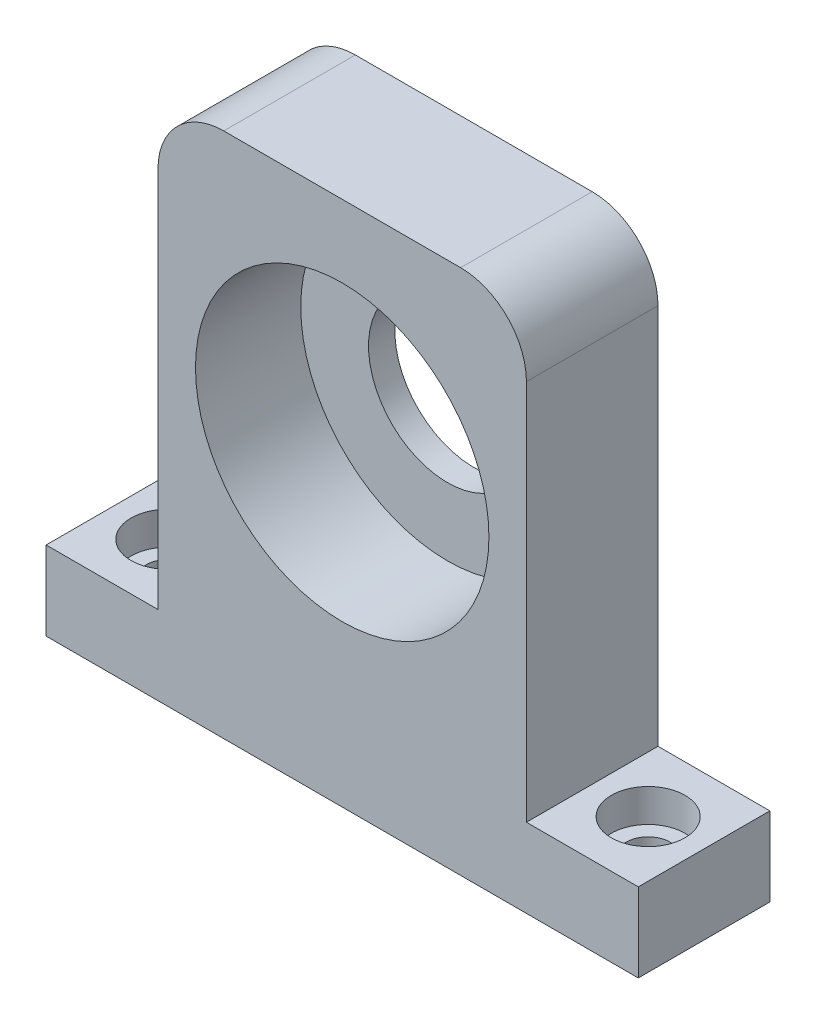
ISO-10303-21;
HEADER;
FILE_DESCRIPTION(('STEP AP214'),'2;1');
FILE_NAME('part.step','',(''),(''),'','','');
FILE_SCHEMA(('AUTOMOTIVE_DESIGN { 1 0 10303 214 1 1 1 1 }'));
ENDSEC;
DATA;
#1=APPLICATION_CONTEXT('core data for automotive mechanical design processes');
#2=APPLICATION_PROTOCOL_DEFINITION('international standard','automotive_design',2000,#1);
#3=PRODUCT_CONTEXT('',#1,'mechanical');
#4=PRODUCT('Part','Part','',(#3));
#5=PRODUCT_RELATED_PRODUCT_CATEGORY('part','',(#4));
#6=PRODUCT_DEFINITION_FORMATION('','',#4);
#7=PRODUCT_DEFINITION_CONTEXT('part definition',#1,'design');
#8=PRODUCT_DEFINITION('design','',#6,#7);
#9=PRODUCT_DEFINITION_SHAPE('','',#8);
#10=(LENGTH_UNIT() NAMED_UNIT(*) SI_UNIT(.MILLI.,.METRE.));
#11=(NAMED_UNIT(*) PLANE_ANGLE_UNIT() SI_UNIT($,.RADIAN.));
#12=(NAMED_UNIT(*) SI_UNIT($,.STERADIAN.) SOLID_ANGLE_UNIT());
#13=UNCERTAINTY_MEASURE_WITH_UNIT(LENGTH_MEASURE(1.E-05),#10,'distance_accuracy_value','');
#14=(GEOMETRIC_REPRESENTATION_CONTEXT(3) GLOBAL_UNCERTAINTY_ASSIGNED_CONTEXT((#13)) GLOBAL_UNIT_ASSIGNED_CONTEXT((#10,
#11,#12)) REPRESENTATION_CONTEXT('',''));
#15=CARTESIAN_POINT('',(0.,0.,0.));
#16=DIRECTION('',(0.,0.,1.));
#17=DIRECTION('',(1.,0.,0.));
#18=AXIS2_PLACEMENT_3D('',#15,#16,#17);
#19=CARTESIAN_POINT('',(0.,17.,10.));
#20=DIRECTION('',(0.,1.,0.));
#21=DIRECTION('',(0.,0.,1.));
#22=AXIS2_PLACEMENT_3D('',#19,#20,#21);
#23=PLANE('',#22);
#24=DIRECTION('',(1.,0.,0.));
#25=VECTOR('',#24,1.);
#26=CARTESIAN_POINT('',(0.,17.,0.));
#27=LINE('',#26,#25);
#28=CARTESIAN_POINT('',(-9.,17.,0.));
#29=VERTEX_POINT('',#28);
#30=CARTESIAN_POINT('',(9.,17.,0.));
#31=VERTEX_POINT('',#30);
#32=EDGE_CURVE('E183',#29,#31,#27,.T.);
#33=ORIENTED_EDGE('',*,*,#32,.F.);
#34=DIRECTION('',(0.,0.,-1.));
#35=VECTOR('',#34,1.);
#36=CARTESIAN_POINT('',(-9.,17.,10.));
#37=LINE('',#36,#35);
#38=CARTESIAN_POINT('',(-9.,17.,10.));
#39=VERTEX_POINT('',#38);
#40=EDGE_CURVE('E230',#29,#39,#37,.F.);
#41=ORIENTED_EDGE('',*,*,#40,.T.);
#42=DIRECTION('',(1.,0.,0.));
#43=VECTOR('',#42,1.);
#44=CARTESIAN_POINT('',(0.,17.,10.));
#45=LINE('',#44,#43);
#46=CARTESIAN_POINT('',(9.,17.,10.));
#47=VERTEX_POINT('',#46);
#48=EDGE_CURVE('E129',#39,#47,#45,.T.);
#49=ORIENTED_EDGE('',*,*,#48,.T.);
#50=DIRECTION('',(0.,0.,-1.));
#51=VECTOR('',#50,1.);
#52=CARTESIAN_POINT('',(9.,17.,10.));
#53=LINE('',#52,#51);
#54=EDGE_CURVE('E226',#47,#31,#53,.T.);
#55=ORIENTED_EDGE('',*,*,#54,.T.);
#56=EDGE_LOOP('',(#33,#41,#49,#55));
#57=FACE_BOUND('',#56,.T.);
#58=ADVANCED_FACE('F16',(#57),#23,.T.);
#59=CARTESIAN_POINT('',(-14.,9.43283759813625,10.));
#60=DIRECTION('',(1.,0.,0.));
#61=DIRECTION('',(0.,1.,0.));
#62=AXIS2_PLACEMENT_3D('',#59,#60,#61);
#63=PLANE('',#62);
#64=DIRECTION('',(0.,-1.,0.));
#65=VECTOR('',#64,1.);
#66=CARTESIAN_POINT('',(-14.,9.43283759813625,10.));
#67=LINE('',#66,#65);
#68=CARTESIAN_POINT('',(-14.,12.,10.));
#69=VERTEX_POINT('',#68);
#70=CARTESIAN_POINT('',(-14.,-17.,10.));
#71=VERTEX_POINT('',#70);
#72=EDGE_CURVE('E117',#69,#71,#67,.T.);
#73=ORIENTED_EDGE('',*,*,#72,.F.);
#74=DIRECTION('',(0.,0.,-1.));
#75=VECTOR('',#74,1.);
#76=CARTESIAN_POINT('',(-14.,12.,0.));
#77=LINE('',#76,#75);
#78=CARTESIAN_POINT('',(-14.,12.,0.));
#79=VERTEX_POINT('',#78);
#80=EDGE_CURVE('E217',#69,#79,#77,.T.);
#81=ORIENTED_EDGE('',*,*,#80,.T.);
#82=DIRECTION('',(0.,-1.,0.));
#83=VECTOR('',#82,1.);
#84=CARTESIAN_POINT('',(-14.,9.43283759813625,0.));
#85=LINE('',#84,#83);
#86=CARTESIAN_POINT('',(-14.,-17.,0.));
#87=VERTEX_POINT('',#86);
#88=EDGE_CURVE('E135',#79,#87,#85,.T.);
#89=ORIENTED_EDGE('',*,*,#88,.T.);
#90=DIRECTION('',(0.,0.,-1.));
#91=VECTOR('',#90,1.);
#92=CARTESIAN_POINT('',(-14.,-17.,10.));
#93=LINE('',#92,#91);
#94=EDGE_CURVE('E132',#71,#87,#93,.T.);
#95=ORIENTED_EDGE('',*,*,#94,.F.);
#96=EDGE_LOOP('',(#73,#81,#89,#95));
#97=FACE_BOUND('',#96,.T.);
#98=ADVANCED_FACE('F133',(#97),#63,.F.);
#99=CARTESIAN_POINT('',(2.3660259321332,-17.,10.));
#100=DIRECTION('',(0.,1.,0.));
#101=DIRECTION('',(-1.,0.,0.));
#102=AXIS2_PLACEMENT_3D('',#99,#100,#101);
#103=PLANE('',#102);
#104=CARTESIAN_POINT('',(-18.25,-17.,5.));
#105=DIRECTION('',(0.,1.,0.));
#106=DIRECTION('',(-1.,0.,0.));
#107=AXIS2_PLACEMENT_3D('',#104,#105,#106);
#108=CIRCLE('',#107,2.8);
#109=CARTESIAN_POINT('',(-21.05,-17.,5.));
#110=VERTEX_POINT('',#109);
#111=EDGE_CURVE('E381',#110,#110,#108,.T.);
#112=ORIENTED_EDGE('',*,*,#111,.F.);
#113=EDGE_LOOP('',(#112));
#114=FACE_BOUND('',#113,.T.);
#115=DIRECTION('',(1.,0.,0.));
#116=VECTOR('',#115,1.);
#117=CARTESIAN_POINT('',(2.3660259321332,-17.,0.));
#118=LINE('',#117,#116);
#119=CARTESIAN_POINT('',(-22.5,-17.,0.));
#120=VERTEX_POINT('',#119);
#121=EDGE_CURVE('E195',#120,#87,#118,.T.);
#122=ORIENTED_EDGE('',*,*,#121,.F.);
#123=DIRECTION('',(0.,0.,-1.));
#124=VECTOR('',#123,1.);
#125=CARTESIAN_POINT('',(-22.5,-17.,10.));
#126=LINE('',#125,#124);
#127=CARTESIAN_POINT('',(-22.5,-17.,10.));
#128=VERTEX_POINT('',#127);
#129=EDGE_CURVE('E141',#128,#120,#126,.T.);
#130=ORIENTED_EDGE('',*,*,#129,.F.);
#131=DIRECTION('',(1.,0.,0.));
#132=VECTOR('',#131,1.);
#133=CARTESIAN_POINT('',(2.3660259321332,-17.,10.));
#134=LINE('',#133,#132);
#135=EDGE_CURVE('E122',#128,#71,#134,.T.);
#136=ORIENTED_EDGE('',*,*,#135,.T.);
#137=ORIENTED_EDGE('',*,*,#94,.T.);
#138=EDGE_LOOP('',(#122,#130,#136,#137));
#139=FACE_BOUND('',#138,.T.);
#140=ADVANCED_FACE('F143',(#114,#139),#103,.T.);
#141=CARTESIAN_POINT('',(-22.5,-23.0140389875682,10.));
#142=DIRECTION('',(1.,0.,0.));
#143=DIRECTION('',(0.,1.,0.));
#144=AXIS2_PLACEMENT_3D('',#141,#142,#143);
#145=PLANE('',#144);
#146=DIRECTION('',(0.,-1.,0.));
#147=VECTOR('',#146,1.);
#148=CARTESIAN_POINT('',(-22.5,-23.0140389875682,0.));
#149=LINE('',#148,#147);
#150=CARTESIAN_POINT('',(-22.5,-23.,0.));
#151=VERTEX_POINT('',#150);
#152=EDGE_CURVE('E198',#120,#151,#149,.T.);
#153=ORIENTED_EDGE('',*,*,#152,.T.);
#154=DIRECTION('',(0.,0.,-1.));
#155=VECTOR('',#154,1.);
#156=CARTESIAN_POINT('',(-22.5,-23.,10.));
#157=LINE('',#156,#155);
#158=CARTESIAN_POINT('',(-22.5,-23.,10.));
#159=VERTEX_POINT('',#158);
#160=EDGE_CURVE('E211',#159,#151,#157,.T.);
#161=ORIENTED_EDGE('',*,*,#160,.F.);
#162=DIRECTION('',(0.,-1.,0.));
#163=VECTOR('',#162,1.);
#164=CARTESIAN_POINT('',(-22.5,-23.0140389875682,10.));
#165=LINE('',#164,#163);
#166=EDGE_CURVE('E146',#128,#159,#165,.T.);
#167=ORIENTED_EDGE('',*,*,#166,.F.);
#168=ORIENTED_EDGE('',*,*,#129,.T.);
#169=EDGE_LOOP('',(#153,#161,#167,#168));
#170=FACE_BOUND('',#169,.T.);
#171=ADVANCED_FACE('F384',(#170),#145,.F.);
#172=CARTESIAN_POINT('',(2.3660259321332,-23.,10.));
#173=DIRECTION('',(0.,1.,0.));
#174=DIRECTION('',(-1.,0.,0.));
#175=AXIS2_PLACEMENT_3D('',#172,#173,#174);
#176=PLANE('',#175);
#177=CARTESIAN_POINT('',(18.25,-23.0000000000245,5.));
#178=DIRECTION('',(0.,-1.,0.));
#179=DIRECTION('',(1.,0.,0.));
#180=AXIS2_PLACEMENT_3D('',#177,#178,#179);
#181=CIRCLE('',#180,1.65);
#182=CARTESIAN_POINT('',(19.9,-23.0000000000245,5.));
#183=VERTEX_POINT('',#182);
#184=EDGE_CURVE('E367',#183,#183,#181,.F.);
#185=ORIENTED_EDGE('',*,*,#184,.T.);
#186=EDGE_LOOP('',(#185));
#187=FACE_BOUND('',#186,.T.);
#188=CARTESIAN_POINT('',(-18.25,-23.0000000000245,5.));
#189=DIRECTION('',(0.,1.,0.));
#190=DIRECTION('',(-1.,0.,0.));
#191=AXIS2_PLACEMENT_3D('',#188,#189,#190);
#192=CIRCLE('',#191,1.65);
#193=CARTESIAN_POINT('',(-19.9,-23.0000000000245,5.));
#194=VERTEX_POINT('',#193);
#195=EDGE_CURVE('E428',#194,#194,#192,.F.);
#196=ORIENTED_EDGE('',*,*,#195,.F.);
#197=EDGE_LOOP('',(#196));
#198=FACE_BOUND('',#197,.T.);
#199=DIRECTION('',(1.,0.,0.));
#200=VECTOR('',#199,1.);
#201=CARTESIAN_POINT('',(2.3660259321332,-23.,0.));
#202=LINE('',#201,#200);
#203=CARTESIAN_POINT('',(22.5,-23.,0.));
#204=VERTEX_POINT('',#203);
#205=EDGE_CURVE('E201',#151,#204,#202,.T.);
#206=ORIENTED_EDGE('',*,*,#205,.T.);
#207=DIRECTION('',(0.,0.,-1.));
#208=VECTOR('',#207,1.);
#209=CARTESIAN_POINT('',(22.5,-23.,10.));
#210=LINE('',#209,#208);
#211=CARTESIAN_POINT('',(22.5,-23.,10.));
#212=VERTEX_POINT('',#211);
#213=EDGE_CURVE('E208',#212,#204,#210,.T.);
#214=ORIENTED_EDGE('',*,*,#213,.F.);
#215=DIRECTION('',(1.,0.,0.));
#216=VECTOR('',#215,1.);
#217=CARTESIAN_POINT('',(2.3660259321332,-23.,10.));
#218=LINE('',#217,#216);
#219=EDGE_CURVE('E154',#159,#212,#218,.T.);
#220=ORIENTED_EDGE('',*,*,#219,.F.);
#221=ORIENTED_EDGE('',*,*,#160,.T.);
#222=EDGE_LOOP('',(#206,#214,#220,#221));
#223=FACE_BOUND('',#222,.T.);
#224=ADVANCED_FACE('F392',(#187,#198,#223),#176,.F.);
#225=CARTESIAN_POINT('',(22.5,-23.0140389875682,10.));
#226=DIRECTION('',(1.,0.,0.));
#227=DIRECTION('',(0.,1.,0.));
#228=AXIS2_PLACEMENT_3D('',#225,#226,#227);
#229=PLANE('',#228);
#230=DIRECTION('',(0.,-1.,0.));
#231=VECTOR('',#230,1.);
#232=CARTESIAN_POINT('',(22.5,-23.0140389875682,0.));
#233=LINE('',#232,#231);
#234=CARTESIAN_POINT('',(22.5,-17.,0.));
#235=VERTEX_POINT('',#234);
#236=EDGE_CURVE('E194',#235,#204,#233,.T.);
#237=ORIENTED_EDGE('',*,*,#236,.F.);
#238=DIRECTION('',(0.,0.,-1.));
#239=VECTOR('',#238,1.);
#240=CARTESIAN_POINT('',(22.5,-17.,10.));
#241=LINE('',#240,#239);
#242=CARTESIAN_POINT('',(22.5,-17.,10.));
#243=VERTEX_POINT('',#242);
#244=EDGE_CURVE('E171',#243,#235,#241,.T.);
#245=ORIENTED_EDGE('',*,*,#244,.F.);
#246=DIRECTION('',(0.,-1.,0.));
#247=VECTOR('',#246,1.);
#248=CARTESIAN_POINT('',(22.5,-23.0140389875682,10.));
#249=LINE('',#248,#247);
#250=EDGE_CURVE('E163',#243,#212,#249,.T.);
#251=ORIENTED_EDGE('',*,*,#250,.T.);
#252=ORIENTED_EDGE('',*,*,#213,.T.);
#253=EDGE_LOOP('',(#237,#245,#251,#252));
#254=FACE_BOUND('',#253,.T.);
#255=ADVANCED_FACE('F400',(#254),#229,.T.);
#256=CARTESIAN_POINT('',(18.25,-17.,5.));
#257=DIRECTION('',(0.,-1.,0.));
#258=DIRECTION('',(1.,0.,0.));
#259=AXIS2_PLACEMENT_3D('',#256,#257,#258);
#260=CIRCLE('',#259,2.8);
#261=CARTESIAN_POINT('',(21.05,-17.,5.));
#262=VERTEX_POINT('',#261);
#263=EDGE_CURVE('E370',#262,#262,#260,.T.);
#264=ORIENTED_EDGE('',*,*,#263,.T.);
#265=EDGE_LOOP('',(#264));
#266=FACE_BOUND('',#265,.T.);
#267=CARTESIAN_POINT('',(14.,-17.,0.));
#268=VERTEX_POINT('',#267);
#269=EDGE_CURVE('E191',#268,#235,#118,.T.);
#270=ORIENTED_EDGE('',*,*,#269,.F.);
#271=DIRECTION('',(0.,0.,-1.));
#272=VECTOR('',#271,1.);
#273=CARTESIAN_POINT('',(14.,-17.,10.));
#274=LINE('',#273,#272);
#275=CARTESIAN_POINT('',(14.,-17.,10.));
#276=VERTEX_POINT('',#275);
#277=EDGE_CURVE('E162',#276,#268,#274,.T.);
#278=ORIENTED_EDGE('',*,*,#277,.F.);
#279=EDGE_CURVE('E149',#276,#243,#134,.T.);
#280=ORIENTED_EDGE('',*,*,#279,.T.);
#281=ORIENTED_EDGE('',*,*,#244,.T.);
#282=EDGE_LOOP('',(#270,#278,#280,#281));
#283=FACE_BOUND('',#282,.T.);
#284=ADVANCED_FACE('F294',(#266,#283),#103,.T.);
#285=CARTESIAN_POINT('',(14.,9.43283759813625,10.));
#286=DIRECTION('',(1.,0.,0.));
#287=DIRECTION('',(0.,1.,0.));
#288=AXIS2_PLACEMENT_3D('',#285,#286,#287);
#289=PLANE('',#288);
#290=DIRECTION('',(0.,-1.,0.));
#291=VECTOR('',#290,1.);
#292=CARTESIAN_POINT('',(14.,9.43283759813625,0.));
#293=LINE('',#292,#291);
#294=CARTESIAN_POINT('',(14.,12.,0.));
#295=VERTEX_POINT('',#294);
#296=EDGE_CURVE('E190',#295,#268,#293,.T.);
#297=ORIENTED_EDGE('',*,*,#296,.F.);
#298=DIRECTION('',(0.,0.,-1.));
#299=VECTOR('',#298,1.);
#300=CARTESIAN_POINT('',(14.,12.,10.));
#301=LINE('',#300,#299);
#302=CARTESIAN_POINT('',(14.,12.,10.));
#303=VERTEX_POINT('',#302);
#304=EDGE_CURVE('E10',#295,#303,#301,.F.);
#305=ORIENTED_EDGE('',*,*,#304,.T.);
#306=DIRECTION('',(0.,-1.,0.));
#307=VECTOR('',#306,1.);
#308=CARTESIAN_POINT('',(14.,9.43283759813625,10.));
#309=LINE('',#308,#307);
#310=EDGE_CURVE('E128',#303,#276,#309,.T.);
#311=ORIENTED_EDGE('',*,*,#310,.T.);
#312=ORIENTED_EDGE('',*,*,#277,.T.);
#313=EDGE_LOOP('',(#297,#305,#311,#312));
#314=FACE_BOUND('',#313,.T.);
#315=ADVANCED_FACE('F290',(#314),#289,.T.);
#316=CARTESIAN_POINT('',(0.,0.35,10.));
#317=DIRECTION('',(0.,0.,-1.));
#318=DIRECTION('',(-1.,0.,0.));
#319=AXIS2_PLACEMENT_3D('',#316,#317,#318);
#320=CYLINDRICAL_SURFACE('',#319,11.15);
#321=CARTESIAN_POINT('',(0.,0.35,2.));
#322=DIRECTION('',(0.,0.,1.));
#323=DIRECTION('',(1.,0.,0.));
#324=AXIS2_PLACEMENT_3D('',#321,#322,#323);
#325=CIRCLE('',#324,11.15);
#326=CARTESIAN_POINT('',(11.15,0.35,2.));
#327=VERTEX_POINT('',#326);
#328=EDGE_CURVE('E140',#327,#327,#325,.T.);
#329=ORIENTED_EDGE('',*,*,#328,.F.);
#330=EDGE_LOOP('',(#329));
#331=FACE_BOUND('',#330,.T.);
#332=CARTESIAN_POINT('',(0.,0.35,10.));
#333=DIRECTION('',(0.,0.,1.));
#334=DIRECTION('',(1.,0.,0.));
#335=AXIS2_PLACEMENT_3D('',#332,#333,#334);
#336=CIRCLE('',#335,11.15);
#337=CARTESIAN_POINT('',(11.15,0.35,10.));
#338=VERTEX_POINT('',#337);
#339=EDGE_CURVE('E147',#338,#338,#336,.T.);
#340=ORIENTED_EDGE('',*,*,#339,.T.);
#341=EDGE_LOOP('',(#340));
#342=FACE_BOUND('',#341,.T.);
#343=ADVANCED_FACE('F280',(#331,#342),#320,.F.);
#344=CARTESIAN_POINT('',(0.,-3.,10.));
#345=DIRECTION('',(0.,0.,1.));
#346=DIRECTION('',(1.,0.,0.));
#347=AXIS2_PLACEMENT_3D('',#344,#345,#346);
#348=PLANE('',#347);
#349=ORIENTED_EDGE('',*,*,#48,.F.);
#350=CARTESIAN_POINT('',(-9.,12.,10.));
#351=DIRECTION('',(0.,0.,1.));
#352=DIRECTION('',(1.,0.,0.));
#353=AXIS2_PLACEMENT_3D('',#350,#351,#352);
#354=CIRCLE('',#353,5.);
#355=EDGE_CURVE('E25',#39,#69,#354,.T.);
#356=ORIENTED_EDGE('',*,*,#355,.T.);
#357=ORIENTED_EDGE('',*,*,#72,.T.);
#358=ORIENTED_EDGE('',*,*,#135,.F.);
#359=ORIENTED_EDGE('',*,*,#166,.T.);
#360=ORIENTED_EDGE('',*,*,#219,.T.);
#361=ORIENTED_EDGE('',*,*,#250,.F.);
#362=ORIENTED_EDGE('',*,*,#279,.F.);
#363=ORIENTED_EDGE('',*,*,#310,.F.);
#364=CARTESIAN_POINT('',(9.,12.,10.));
#365=DIRECTION('',(0.,0.,1.));
#366=DIRECTION('',(1.,0.,0.));
#367=AXIS2_PLACEMENT_3D('',#364,#365,#366);
#368=CIRCLE('',#367,5.);
#369=EDGE_CURVE('E45',#303,#47,#368,.T.);
#370=ORIENTED_EDGE('',*,*,#369,.T.);
#371=EDGE_LOOP('',(#349,#356,#357,#358,#359,#360,#361,#362,#363,#370));
#372=FACE_BOUND('',#371,.T.);
#373=ORIENTED_EDGE('',*,*,#339,.F.);
#374=EDGE_LOOP('',(#373));
#375=FACE_BOUND('',#374,.T.);
#376=ADVANCED_FACE('F119',(#372,#375),#348,.T.);
#377=CARTESIAN_POINT('',(0.,-3.,0.));
#378=DIRECTION('',(0.,0.,1.));
#379=DIRECTION('',(1.,0.,0.));
#380=AXIS2_PLACEMENT_3D('',#377,#378,#379);
#381=PLANE('',#380);
#382=ORIENTED_EDGE('',*,*,#88,.F.);
#383=CARTESIAN_POINT('',(-9.,12.,0.));
#384=DIRECTION('',(0.,0.,1.));
#385=DIRECTION('',(1.,0.,0.));
#386=AXIS2_PLACEMENT_3D('',#383,#384,#385);
#387=CIRCLE('',#386,5.);
#388=EDGE_CURVE('E223',#79,#29,#387,.F.);
#389=ORIENTED_EDGE('',*,*,#388,.T.);
#390=ORIENTED_EDGE('',*,*,#32,.T.);
#391=CARTESIAN_POINT('',(9.,12.,0.));
#392=DIRECTION('',(0.,0.,1.));
#393=DIRECTION('',(1.,0.,0.));
#394=AXIS2_PLACEMENT_3D('',#391,#392,#393);
#395=CIRCLE('',#394,5.);
#396=EDGE_CURVE('E220',#31,#295,#395,.F.);
#397=ORIENTED_EDGE('',*,*,#396,.T.);
#398=ORIENTED_EDGE('',*,*,#296,.T.);
#399=ORIENTED_EDGE('',*,*,#269,.T.);
#400=ORIENTED_EDGE('',*,*,#236,.T.);
#401=ORIENTED_EDGE('',*,*,#205,.F.);
#402=ORIENTED_EDGE('',*,*,#152,.F.);
#403=ORIENTED_EDGE('',*,*,#121,.T.);
#404=EDGE_LOOP('',(#382,#389,#390,#397,#398,#399,#400,#401,#402,#403));
#405=FACE_BOUND('',#404,.T.);
#406=CARTESIAN_POINT('',(0.,0.35,0.));
#407=DIRECTION('',(0.,0.,1.));
#408=DIRECTION('',(1.,0.,0.));
#409=AXIS2_PLACEMENT_3D('',#406,#407,#408);
#410=CIRCLE('',#409,6.);
#411=CARTESIAN_POINT('',(6.,0.35,0.));
#412=VERTEX_POINT('',#411);
#413=EDGE_CURVE('E426',#412,#412,#410,.T.);
#414=ORIENTED_EDGE('',*,*,#413,.T.);
#415=EDGE_LOOP('',(#414));
#416=FACE_BOUND('',#415,.T.);
#417=ADVANCED_FACE('F279',(#405,#416),#381,.F.);
#418=CARTESIAN_POINT('',(0.,0.35,2.));
#419=DIRECTION('',(0.,0.,-1.));
#420=DIRECTION('',(-1.,0.,0.));
#421=AXIS2_PLACEMENT_3D('',#418,#419,#420);
#422=CYLINDRICAL_SURFACE('',#421,6.);
#423=CARTESIAN_POINT('',(0.,0.35,2.));
#424=DIRECTION('',(0.,0.,1.));
#425=DIRECTION('',(1.,0.,0.));
#426=AXIS2_PLACEMENT_3D('',#423,#424,#425);
#427=CIRCLE('',#426,6.);
#428=CARTESIAN_POINT('',(6.,0.35,2.));
#429=VERTEX_POINT('',#428);
#430=EDGE_CURVE('E187',#429,#429,#427,.T.);
#431=ORIENTED_EDGE('',*,*,#430,.T.);
#432=EDGE_LOOP('',(#431));
#433=FACE_BOUND('',#432,.T.);
#434=ORIENTED_EDGE('',*,*,#413,.F.);
#435=EDGE_LOOP('',(#434));
#436=FACE_BOUND('',#435,.T.);
#437=ADVANCED_FACE('F299',(#433,#436),#422,.F.);
#438=CARTESIAN_POINT('',(0.,-3.,2.));
#439=DIRECTION('',(0.,0.,1.));
#440=DIRECTION('',(1.,0.,0.));
#441=AXIS2_PLACEMENT_3D('',#438,#439,#440);
#442=PLANE('',#441);
#443=ORIENTED_EDGE('',*,*,#430,.F.);
#444=EDGE_LOOP('',(#443));
#445=FACE_BOUND('',#444,.T.);
#446=ORIENTED_EDGE('',*,*,#328,.T.);
#447=EDGE_LOOP('',(#446));
#448=FACE_BOUND('',#447,.T.);
#449=ADVANCED_FACE('F308',(#445,#448),#442,.T.);
#450=CARTESIAN_POINT('',(-18.2499999998776,-500000.,5.));
#451=DIRECTION('',(0.,1.,0.));
#452=DIRECTION('',(-1.,0.,0.));
#453=AXIS2_PLACEMENT_3D('',#450,#451,#452);
#454=CYLINDRICAL_SURFACE('',#453,1.65);
#455=CARTESIAN_POINT('',(-18.25,-19.5,5.));
#456=DIRECTION('',(0.,1.,0.));
#457=DIRECTION('',(-1.,0.,0.));
#458=AXIS2_PLACEMENT_3D('',#455,#456,#457);
#459=CIRCLE('',#458,1.65);
#460=CARTESIAN_POINT('',(-19.9,-19.5,5.));
#461=VERTEX_POINT('',#460);
#462=EDGE_CURVE('E441',#461,#461,#459,.T.);
#463=ORIENTED_EDGE('',*,*,#462,.T.);
#464=EDGE_LOOP('',(#463));
#465=FACE_BOUND('',#464,.T.);
#466=ORIENTED_EDGE('',*,*,#195,.T.);
#467=EDGE_LOOP('',(#466));
#468=FACE_BOUND('',#467,.T.);
#469=ADVANCED_FACE('F316',(#465,#468),#454,.F.);
#470=CARTESIAN_POINT('',(-18.25,-19.5,5.));
#471=DIRECTION('',(0.,1.,0.));
#472=DIRECTION('',(-1.,0.,0.));
#473=AXIS2_PLACEMENT_3D('',#470,#471,#472);
#474=CYLINDRICAL_SURFACE('',#473,2.8);
#475=CARTESIAN_POINT('',(-18.25,-19.5,5.));
#476=DIRECTION('',(0.,1.,0.));
#477=DIRECTION('',(-1.,0.,0.));
#478=AXIS2_PLACEMENT_3D('',#475,#476,#477);
#479=CIRCLE('',#478,2.8);
#480=CARTESIAN_POINT('',(-21.05,-19.5,5.));
#481=VERTEX_POINT('',#480);
#482=EDGE_CURVE('E435',#481,#481,#479,.T.);
#483=ORIENTED_EDGE('',*,*,#482,.F.);
#484=EDGE_LOOP('',(#483));
#485=FACE_BOUND('',#484,.T.);
#486=ORIENTED_EDGE('',*,*,#111,.T.);
#487=EDGE_LOOP('',(#486));
#488=FACE_BOUND('',#487,.T.);
#489=ADVANCED_FACE('F324',(#485,#488),#474,.F.);
#490=CARTESIAN_POINT('',(-18.25,-19.5,5.));
#491=DIRECTION('',(0.,1.,0.));
#492=DIRECTION('',(-1.,0.,0.));
#493=AXIS2_PLACEMENT_3D('',#490,#491,#492);
#494=PLANE('',#493);
#495=ORIENTED_EDGE('',*,*,#462,.F.);
#496=EDGE_LOOP('',(#495));
#497=FACE_BOUND('',#496,.T.);
#498=ORIENTED_EDGE('',*,*,#482,.T.);
#499=EDGE_LOOP('',(#498));
#500=FACE_BOUND('',#499,.T.);
#501=ADVANCED_FACE('F332',(#497,#500),#494,.T.);
#502=CARTESIAN_POINT('',(18.2499999998776,-500000.,5.));
#503=DIRECTION('',(0.,1.,0.));
#504=DIRECTION('',(1.,0.,0.));
#505=AXIS2_PLACEMENT_3D('',#502,#503,#504);
#506=CYLINDRICAL_SURFACE('',#505,1.65);
#507=CARTESIAN_POINT('',(18.25,-19.5,5.));
#508=DIRECTION('',(0.,-1.,0.));
#509=DIRECTION('',(1.,0.,0.));
#510=AXIS2_PLACEMENT_3D('',#507,#508,#509);
#511=CIRCLE('',#510,1.65);
#512=CARTESIAN_POINT('',(19.9,-19.5,5.));
#513=VERTEX_POINT('',#512);
#514=EDGE_CURVE('E368',#513,#513,#511,.T.);
#515=ORIENTED_EDGE('',*,*,#514,.F.);
#516=EDGE_LOOP('',(#515));
#517=FACE_BOUND('',#516,.T.);
#518=ORIENTED_EDGE('',*,*,#184,.F.);
#519=EDGE_LOOP('',(#518));
#520=FACE_BOUND('',#519,.T.);
#521=ADVANCED_FACE('F339',(#517,#520),#506,.F.);
#522=CARTESIAN_POINT('',(18.25,-19.5,5.));
#523=DIRECTION('',(0.,1.,0.));
#524=DIRECTION('',(1.,0.,0.));
#525=AXIS2_PLACEMENT_3D('',#522,#523,#524);
#526=CYLINDRICAL_SURFACE('',#525,2.8);
#527=CARTESIAN_POINT('',(18.25,-19.5,5.));
#528=DIRECTION('',(0.,-1.,0.));
#529=DIRECTION('',(1.,0.,0.));
#530=AXIS2_PLACEMENT_3D('',#527,#528,#529);
#531=CIRCLE('',#530,2.8);
#532=CARTESIAN_POINT('',(21.05,-19.5,5.));
#533=VERTEX_POINT('',#532);
#534=EDGE_CURVE('E363',#533,#533,#531,.T.);
#535=ORIENTED_EDGE('',*,*,#534,.T.);
#536=EDGE_LOOP('',(#535));
#537=FACE_BOUND('',#536,.T.);
#538=ORIENTED_EDGE('',*,*,#263,.F.);
#539=EDGE_LOOP('',(#538));
#540=FACE_BOUND('',#539,.T.);
#541=ADVANCED_FACE('F347',(#537,#540),#526,.F.);
#542=CARTESIAN_POINT('',(18.25,-19.5,5.));
#543=DIRECTION('',(0.,1.,0.));
#544=DIRECTION('',(1.,0.,0.));
#545=AXIS2_PLACEMENT_3D('',#542,#543,#544);
#546=PLANE('',#545);
#547=ORIENTED_EDGE('',*,*,#514,.T.);
#548=EDGE_LOOP('',(#547));
#549=FACE_BOUND('',#548,.T.);
#550=ORIENTED_EDGE('',*,*,#534,.F.);
#551=EDGE_LOOP('',(#550));
#552=FACE_BOUND('',#551,.T.);
#553=ADVANCED_FACE('F259',(#549,#552),#546,.T.);
#554=CARTESIAN_POINT('',(-9.,12.,10.));
#555=DIRECTION('',(0.,0.,1.));
#556=DIRECTION('',(1.,0.,0.));
#557=AXIS2_PLACEMENT_3D('',#554,#555,#556);
#558=CYLINDRICAL_SURFACE('',#557,5.);
#559=ORIENTED_EDGE('',*,*,#355,.F.);
#560=ORIENTED_EDGE('',*,*,#40,.F.);
#561=ORIENTED_EDGE('',*,*,#388,.F.);
#562=ORIENTED_EDGE('',*,*,#80,.F.);
#563=EDGE_LOOP('',(#559,#560,#561,#562));
#564=FACE_BOUND('',#563,.T.);
#565=ADVANCED_FACE('F255',(#564),#558,.T.);
#566=CARTESIAN_POINT('',(9.,12.,10.));
#567=DIRECTION('',(0.,0.,-1.));
#568=DIRECTION('',(-1.,0.,0.));
#569=AXIS2_PLACEMENT_3D('',#566,#567,#568);
#570=CYLINDRICAL_SURFACE('',#569,5.);
#571=ORIENTED_EDGE('',*,*,#369,.F.);
#572=ORIENTED_EDGE('',*,*,#304,.F.);
#573=ORIENTED_EDGE('',*,*,#396,.F.);
#574=ORIENTED_EDGE('',*,*,#54,.F.);
#575=EDGE_LOOP('',(#571,#572,#573,#574));
#576=FACE_BOUND('',#575,.T.);
#577=ADVANCED_FACE('F18',(#576),#570,.T.);
#578=CLOSED_SHELL('',(#58,#98,#140,#171,#224,#255,#284,#315,#343,#376,#417,#437,#449,#469,#489,
#501,#521,#541,#553,#565,#577));
#579=MANIFOLD_SOLID_BREP('B1',#578);
#580=ADVANCED_BREP_SHAPE_REPRESENTATION('',(#18,#579),#14);
#581=SHAPE_DEFINITION_REPRESENTATION(#9,#580);
ENDSEC;
END-ISO-10303-21;
